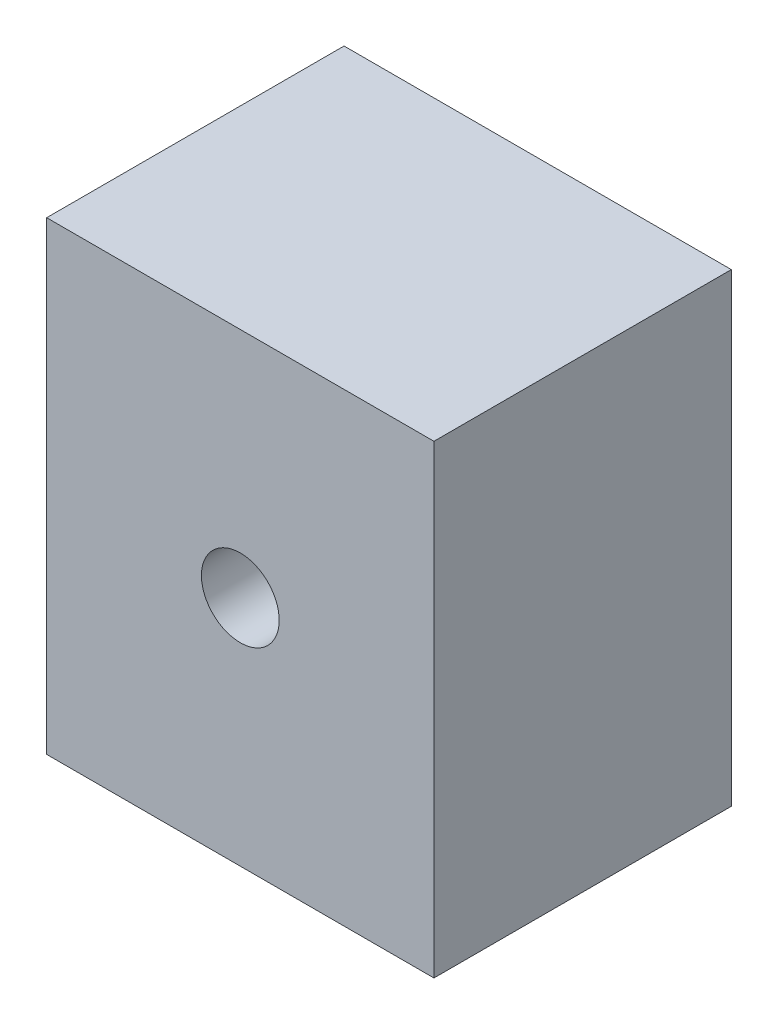
ISO-10303-21;
HEADER;
FILE_DESCRIPTION(('STEP AP214'),'2;1');
FILE_NAME('part.step','',(''),(''),'','','');
FILE_SCHEMA(('AUTOMOTIVE_DESIGN { 1 0 10303 214 1 1 1 1 }'));
ENDSEC;
DATA;
#1=APPLICATION_CONTEXT('core data for automotive mechanical design processes');
#2=APPLICATION_PROTOCOL_DEFINITION('international standard','automotive_design',2000,#1);
#3=PRODUCT_CONTEXT('',#1,'mechanical');
#4=PRODUCT('Part','Part','',(#3));
#5=PRODUCT_RELATED_PRODUCT_CATEGORY('part','',(#4));
#6=PRODUCT_DEFINITION_FORMATION('','',#4);
#7=PRODUCT_DEFINITION_CONTEXT('part definition',#1,'design');
#8=PRODUCT_DEFINITION('design','',#6,#7);
#9=PRODUCT_DEFINITION_SHAPE('','',#8);
#10=(LENGTH_UNIT() NAMED_UNIT(*) SI_UNIT(.MILLI.,.METRE.));
#11=(NAMED_UNIT(*) PLANE_ANGLE_UNIT() SI_UNIT($,.RADIAN.));
#12=(NAMED_UNIT(*) SI_UNIT($,.STERADIAN.) SOLID_ANGLE_UNIT());
#13=UNCERTAINTY_MEASURE_WITH_UNIT(LENGTH_MEASURE(1.E-05),#10,'distance_accuracy_value','');
#14=(GEOMETRIC_REPRESENTATION_CONTEXT(3) GLOBAL_UNCERTAINTY_ASSIGNED_CONTEXT((#13)) GLOBAL_UNIT_ASSIGNED_CONTEXT((#10,
#11,#12)) REPRESENTATION_CONTEXT('',''));
#15=CARTESIAN_POINT('',(0.,0.,0.));
#16=DIRECTION('',(0.,0.,1.));
#17=DIRECTION('',(1.,0.,0.));
#18=AXIS2_PLACEMENT_3D('',#15,#16,#17);
#19=CARTESIAN_POINT('',(-8.4644088498027,10.16,-10.));
#20=DIRECTION('',(1.,0.,0.));
#21=DIRECTION('',(0.,0.,-1.));
#22=AXIS2_PLACEMENT_3D('',#19,#20,#21);
#23=PLANE('',#22);
#24=DIRECTION('',(0.,0.,1.));
#25=VECTOR('',#24,1.);
#26=CARTESIAN_POINT('',(-8.4644088498027,-10.16,-10.));
#27=LINE('',#26,#25);
#28=CARTESIAN_POINT('',(-8.4644088498027,-10.16,-10.));
#29=VERTEX_POINT('',#28);
#30=CARTESIAN_POINT('',(-8.4644088498027,-10.16,3.));
#31=VERTEX_POINT('',#30);
#32=EDGE_CURVE('E195',#29,#31,#27,.T.);
#33=ORIENTED_EDGE('',*,*,#32,.T.);
#34=DIRECTION('',(0.,-1.,0.));
#35=VECTOR('',#34,1.);
#36=CARTESIAN_POINT('',(-8.4644088498027,10.16,3.));
#37=LINE('',#36,#35);
#38=CARTESIAN_POINT('',(-8.4644088498027,10.16,3.));
#39=VERTEX_POINT('',#38);
#40=EDGE_CURVE('E11',#39,#31,#37,.T.);
#41=ORIENTED_EDGE('',*,*,#40,.F.);
#42=DIRECTION('',(0.,0.,1.));
#43=VECTOR('',#42,1.);
#44=CARTESIAN_POINT('',(-8.4644088498027,10.16,-10.));
#45=LINE('',#44,#43);
#46=CARTESIAN_POINT('',(-8.4644088498027,10.16,-10.));
#47=VERTEX_POINT('',#46);
#48=EDGE_CURVE('E207',#47,#39,#45,.T.);
#49=ORIENTED_EDGE('',*,*,#48,.F.);
#50=DIRECTION('',(0.,-1.,0.));
#51=VECTOR('',#50,1.);
#52=CARTESIAN_POINT('',(-8.4644088498027,10.16,-10.));
#53=LINE('',#52,#51);
#54=EDGE_CURVE('E217',#47,#29,#53,.T.);
#55=ORIENTED_EDGE('',*,*,#54,.T.);
#56=EDGE_LOOP('',(#33,#41,#49,#55));
#57=FACE_BOUND('',#56,.T.);
#58=ADVANCED_FACE('F45',(#57),#23,.F.);
#59=CARTESIAN_POINT('',(-8.4644088498027,10.16,3.));
#60=DIRECTION('',(0.,0.,-1.));
#61=DIRECTION('',(-1.,0.,0.));
#62=AXIS2_PLACEMENT_3D('',#59,#60,#61);
#63=PLANE('',#62);
#64=CARTESIAN_POINT('',(0.,0.,3.));
#65=DIRECTION('',(0.,0.,-1.));
#66=DIRECTION('',(-1.,0.,0.));
#67=AXIS2_PLACEMENT_3D('',#64,#65,#66);
#68=CIRCLE('',#67,1.7);
#69=CARTESIAN_POINT('',(-1.7,0.,3.));
#70=VERTEX_POINT('',#69);
#71=EDGE_CURVE('E162',#70,#70,#68,.T.);
#72=ORIENTED_EDGE('',*,*,#71,.T.);
#73=EDGE_LOOP('',(#72));
#74=FACE_BOUND('',#73,.T.);
#75=DIRECTION('',(1.,0.,0.));
#76=VECTOR('',#75,1.);
#77=CARTESIAN_POINT('',(-8.4644088498027,-10.16,3.));
#78=LINE('',#77,#76);
#79=CARTESIAN_POINT('',(8.4644088498027,-10.16,3.));
#80=VERTEX_POINT('',#79);
#81=EDGE_CURVE('E221',#31,#80,#78,.T.);
#82=ORIENTED_EDGE('',*,*,#81,.T.);
#83=DIRECTION('',(0.,-1.,0.));
#84=VECTOR('',#83,1.);
#85=CARTESIAN_POINT('',(8.4644088498027,10.16,3.));
#86=LINE('',#85,#84);
#87=CARTESIAN_POINT('',(8.4644088498027,10.16,3.));
#88=VERTEX_POINT('',#87);
#89=EDGE_CURVE('E53',#88,#80,#86,.T.);
#90=ORIENTED_EDGE('',*,*,#89,.F.);
#91=DIRECTION('',(1.,0.,0.));
#92=VECTOR('',#91,1.);
#93=CARTESIAN_POINT('',(-8.4644088498027,10.16,3.));
#94=LINE('',#93,#92);
#95=EDGE_CURVE('E97',#39,#88,#94,.T.);
#96=ORIENTED_EDGE('',*,*,#95,.F.);
#97=ORIENTED_EDGE('',*,*,#40,.T.);
#98=EDGE_LOOP('',(#82,#90,#96,#97));
#99=FACE_BOUND('',#98,.T.);
#100=ADVANCED_FACE('F258',(#74,#99),#63,.F.);
#101=CARTESIAN_POINT('',(8.4644088498027,10.16,-10.));
#102=DIRECTION('',(-1.,0.,0.));
#103=DIRECTION('',(0.,0.,1.));
#104=AXIS2_PLACEMENT_3D('',#101,#102,#103);
#105=PLANE('',#104);
#106=DIRECTION('',(0.,0.,-1.));
#107=VECTOR('',#106,1.);
#108=CARTESIAN_POINT('',(8.4644088498027,-10.16,-10.));
#109=LINE('',#108,#107);
#110=CARTESIAN_POINT('',(8.4644088498027,-10.16,-10.));
#111=VERTEX_POINT('',#110);
#112=EDGE_CURVE('E224',#80,#111,#109,.T.);
#113=ORIENTED_EDGE('',*,*,#112,.T.);
#114=DIRECTION('',(0.,-1.,0.));
#115=VECTOR('',#114,1.);
#116=CARTESIAN_POINT('',(8.4644088498027,10.16,-10.));
#117=LINE('',#116,#115);
#118=CARTESIAN_POINT('',(8.4644088498027,10.16,-10.));
#119=VERTEX_POINT('',#118);
#120=EDGE_CURVE('E231',#119,#111,#117,.T.);
#121=ORIENTED_EDGE('',*,*,#120,.F.);
#122=DIRECTION('',(0.,0.,-1.));
#123=VECTOR('',#122,1.);
#124=CARTESIAN_POINT('',(8.4644088498027,10.16,-10.));
#125=LINE('',#124,#123);
#126=EDGE_CURVE('E212',#88,#119,#125,.T.);
#127=ORIENTED_EDGE('',*,*,#126,.F.);
#128=ORIENTED_EDGE('',*,*,#89,.T.);
#129=EDGE_LOOP('',(#113,#121,#127,#128));
#130=FACE_BOUND('',#129,.T.);
#131=ADVANCED_FACE('F238',(#130),#105,.F.);
#132=CARTESIAN_POINT('',(-8.4644088498027,10.16,-10.));
#133=DIRECTION('',(0.,0.,1.));
#134=DIRECTION('',(1.,0.,0.));
#135=AXIS2_PLACEMENT_3D('',#132,#133,#134);
#136=PLANE('',#135);
#137=DIRECTION('',(-0.499999999999995,0.866025403784442,0.));
#138=VECTOR('',#137,1.);
#139=CARTESIAN_POINT('',(-2.10011160417727,-1.21249999999999,-10.));
#140=LINE('',#139,#138);
#141=CARTESIAN_POINT('',(-1.40007440278487,-2.42499999999998,-10.));
#142=VERTEX_POINT('',#141);
#143=CARTESIAN_POINT('',(-2.80014880556968,0.,-10.));
#144=VERTEX_POINT('',#143);
#145=EDGE_CURVE('E178',#142,#144,#140,.T.);
#146=ORIENTED_EDGE('',*,*,#145,.F.);
#147=DIRECTION('',(-1.,0.,0.));
#148=VECTOR('',#147,1.);
#149=CARTESIAN_POINT('',(0.,-2.42499999999999,-10.));
#150=LINE('',#149,#148);
#151=CARTESIAN_POINT('',(1.40007440278481,-2.425,-10.));
#152=VERTEX_POINT('',#151);
#153=EDGE_CURVE('E60',#152,#142,#150,.T.);
#154=ORIENTED_EDGE('',*,*,#153,.F.);
#155=DIRECTION('',(-0.500000000000007,-0.866025403784435,0.));
#156=VECTOR('',#155,1.);
#157=CARTESIAN_POINT('',(2.10011160417724,-1.21250000000001,-10.));
#158=LINE('',#157,#156);
#159=CARTESIAN_POINT('',(2.80014880556968,0.,-10.));
#160=VERTEX_POINT('',#159);
#161=EDGE_CURVE('E155',#160,#152,#158,.T.);
#162=ORIENTED_EDGE('',*,*,#161,.F.);
#163=DIRECTION('',(0.499999999999995,-0.866025403784442,0.));
#164=VECTOR('',#163,1.);
#165=CARTESIAN_POINT('',(2.10011160417726,1.21249999999998,-10.));
#166=LINE('',#165,#164);
#167=CARTESIAN_POINT('',(1.40007440278485,2.42499999999998,-10.));
#168=VERTEX_POINT('',#167);
#169=EDGE_CURVE('E159',#168,#160,#166,.T.);
#170=ORIENTED_EDGE('',*,*,#169,.F.);
#171=DIRECTION('',(1.,0.,0.));
#172=VECTOR('',#171,1.);
#173=CARTESIAN_POINT('',(0.,2.42499999999999,-10.));
#174=LINE('',#173,#172);
#175=CARTESIAN_POINT('',(-1.40007440278483,2.42499999999999,-10.));
#176=VERTEX_POINT('',#175);
#177=EDGE_CURVE('E185',#176,#168,#174,.T.);
#178=ORIENTED_EDGE('',*,*,#177,.F.);
#179=DIRECTION('',(0.500000000000001,0.866025403784438,0.));
#180=VECTOR('',#179,1.);
#181=CARTESIAN_POINT('',(-2.10011160417725,1.2125,-10.));
#182=LINE('',#181,#180);
#183=EDGE_CURVE('E181',#144,#176,#182,.T.);
#184=ORIENTED_EDGE('',*,*,#183,.F.);
#185=EDGE_LOOP('',(#146,#154,#162,#170,#178,#184));
#186=FACE_BOUND('',#185,.T.);
#187=DIRECTION('',(-1.,0.,0.));
#188=VECTOR('',#187,1.);
#189=CARTESIAN_POINT('',(-8.4644088498027,-10.16,-10.));
#190=LINE('',#189,#188);
#191=EDGE_CURVE('E90',#111,#29,#190,.T.);
#192=ORIENTED_EDGE('',*,*,#191,.T.);
#193=ORIENTED_EDGE('',*,*,#54,.F.);
#194=DIRECTION('',(-1.,0.,0.));
#195=VECTOR('',#194,1.);
#196=CARTESIAN_POINT('',(-8.4644088498027,10.16,-10.));
#197=LINE('',#196,#195);
#198=EDGE_CURVE('E69',#119,#47,#197,.T.);
#199=ORIENTED_EDGE('',*,*,#198,.F.);
#200=ORIENTED_EDGE('',*,*,#120,.T.);
#201=EDGE_LOOP('',(#192,#193,#199,#200));
#202=FACE_BOUND('',#201,.T.);
#203=ADVANCED_FACE('F246',(#186,#202),#136,.F.);
#204=CARTESIAN_POINT('',(0.,10.16,0.));
#205=DIRECTION('',(0.,1.,0.));
#206=DIRECTION('',(0.,0.,1.));
#207=AXIS2_PLACEMENT_3D('',#204,#205,#206);
#208=PLANE('',#207);
#209=ORIENTED_EDGE('',*,*,#48,.T.);
#210=ORIENTED_EDGE('',*,*,#95,.T.);
#211=ORIENTED_EDGE('',*,*,#126,.T.);
#212=ORIENTED_EDGE('',*,*,#198,.T.);
#213=EDGE_LOOP('',(#209,#210,#211,#212));
#214=FACE_BOUND('',#213,.T.);
#215=ADVANCED_FACE('F248',(#214),#208,.T.);
#216=CARTESIAN_POINT('',(0.,-10.16,0.));
#217=DIRECTION('',(0.,1.,0.));
#218=DIRECTION('',(0.,0.,1.));
#219=AXIS2_PLACEMENT_3D('',#216,#217,#218);
#220=PLANE('',#219);
#221=ORIENTED_EDGE('',*,*,#32,.F.);
#222=ORIENTED_EDGE('',*,*,#191,.F.);
#223=ORIENTED_EDGE('',*,*,#112,.F.);
#224=ORIENTED_EDGE('',*,*,#81,.F.);
#225=EDGE_LOOP('',(#221,#222,#223,#224));
#226=FACE_BOUND('',#225,.T.);
#227=ADVANCED_FACE('F242',(#226),#220,.F.);
#228=CARTESIAN_POINT('',(0.,-2.42499999999999,-0.0940000000000229));
#229=DIRECTION('',(0.,-1.,0.));
#230=DIRECTION('',(1.,0.,0.));
#231=AXIS2_PLACEMENT_3D('',#228,#229,#230);
#232=PLANE('',#231);
#233=ORIENTED_EDGE('',*,*,#153,.T.);
#234=DIRECTION('',(0.,0.,-1.));
#235=VECTOR('',#234,1.);
#236=CARTESIAN_POINT('',(-1.40007440278487,-2.42499999999997,-0.0940000000000229));
#237=LINE('',#236,#235);
#238=CARTESIAN_POINT('',(-1.40007440278487,-2.42499999999997,-0.0940000000000229));
#239=VERTEX_POINT('',#238);
#240=EDGE_CURVE('E129',#239,#142,#237,.T.);
#241=ORIENTED_EDGE('',*,*,#240,.F.);
#242=DIRECTION('',(-1.,0.,0.));
#243=VECTOR('',#242,1.);
#244=CARTESIAN_POINT('',(0.,-2.42499999999999,-0.0940000000000229));
#245=LINE('',#244,#243);
#246=CARTESIAN_POINT('',(1.40007440278481,-2.425,-0.0940000000000229));
#247=VERTEX_POINT('',#246);
#248=EDGE_CURVE('E133',#247,#239,#245,.T.);
#249=ORIENTED_EDGE('',*,*,#248,.F.);
#250=DIRECTION('',(0.,0.,-1.));
#251=VECTOR('',#250,1.);
#252=CARTESIAN_POINT('',(1.40007440278481,-2.425,-0.0940000000000229));
#253=LINE('',#252,#251);
#254=EDGE_CURVE('E192',#247,#152,#253,.T.);
#255=ORIENTED_EDGE('',*,*,#254,.T.);
#256=EDGE_LOOP('',(#233,#241,#249,#255));
#257=FACE_BOUND('',#256,.T.);
#258=ADVANCED_FACE('F131',(#257),#232,.F.);
#259=CARTESIAN_POINT('',(2.10011160417724,-1.21250000000001,-0.0940000000000229));
#260=DIRECTION('',(0.866025403784435,-0.500000000000007,0.));
#261=DIRECTION('',(0.500000000000007,0.866025403784435,0.));
#262=AXIS2_PLACEMENT_3D('',#259,#260,#261);
#263=PLANE('',#262);
#264=ORIENTED_EDGE('',*,*,#161,.T.);
#265=ORIENTED_EDGE('',*,*,#254,.F.);
#266=DIRECTION('',(-0.500000000000007,-0.866025403784435,0.));
#267=VECTOR('',#266,1.);
#268=CARTESIAN_POINT('',(2.10011160417724,-1.21250000000001,-0.0940000000000229));
#269=LINE('',#268,#267);
#270=CARTESIAN_POINT('',(2.80014880556968,0.,-0.0940000000000229));
#271=VERTEX_POINT('',#270);
#272=EDGE_CURVE('E140',#271,#247,#269,.T.);
#273=ORIENTED_EDGE('',*,*,#272,.F.);
#274=DIRECTION('',(0.,0.,-1.));
#275=VECTOR('',#274,1.);
#276=CARTESIAN_POINT('',(2.80014880556968,0.,-0.0940000000000229));
#277=LINE('',#276,#275);
#278=EDGE_CURVE('E196',#271,#160,#277,.T.);
#279=ORIENTED_EDGE('',*,*,#278,.T.);
#280=EDGE_LOOP('',(#264,#265,#273,#279));
#281=FACE_BOUND('',#280,.T.);
#282=ADVANCED_FACE('F289',(#281),#263,.F.);
#283=CARTESIAN_POINT('',(2.10011160417726,1.21249999999998,-0.0940000000000229));
#284=DIRECTION('',(0.866025403784442,0.499999999999995,0.));
#285=DIRECTION('',(-0.499999999999995,0.866025403784442,0.));
#286=AXIS2_PLACEMENT_3D('',#283,#284,#285);
#287=PLANE('',#286);
#288=ORIENTED_EDGE('',*,*,#169,.T.);
#289=ORIENTED_EDGE('',*,*,#278,.F.);
#290=DIRECTION('',(0.499999999999995,-0.866025403784442,0.));
#291=VECTOR('',#290,1.);
#292=CARTESIAN_POINT('',(2.10011160417726,1.21249999999998,-0.0940000000000229));
#293=LINE('',#292,#291);
#294=CARTESIAN_POINT('',(1.40007440278485,2.42499999999998,-0.0940000000000229));
#295=VERTEX_POINT('',#294);
#296=EDGE_CURVE('E171',#295,#271,#293,.T.);
#297=ORIENTED_EDGE('',*,*,#296,.F.);
#298=DIRECTION('',(0.,0.,-1.));
#299=VECTOR('',#298,1.);
#300=CARTESIAN_POINT('',(1.40007440278485,2.42499999999998,-0.0940000000000229));
#301=LINE('',#300,#299);
#302=EDGE_CURVE('E199',#295,#168,#301,.T.);
#303=ORIENTED_EDGE('',*,*,#302,.T.);
#304=EDGE_LOOP('',(#288,#289,#297,#303));
#305=FACE_BOUND('',#304,.T.);
#306=ADVANCED_FACE('F292',(#305),#287,.F.);
#307=CARTESIAN_POINT('',(0.,2.42499999999999,-0.0940000000000229));
#308=DIRECTION('',(0.,1.,0.));
#309=DIRECTION('',(-1.,0.,0.));
#310=AXIS2_PLACEMENT_3D('',#307,#308,#309);
#311=PLANE('',#310);
#312=ORIENTED_EDGE('',*,*,#177,.T.);
#313=ORIENTED_EDGE('',*,*,#302,.F.);
#314=DIRECTION('',(1.,0.,0.));
#315=VECTOR('',#314,1.);
#316=CARTESIAN_POINT('',(0.,2.42499999999999,-0.0940000000000229));
#317=LINE('',#316,#315);
#318=CARTESIAN_POINT('',(-1.40007440278483,2.42499999999999,-0.0940000000000229));
#319=VERTEX_POINT('',#318);
#320=EDGE_CURVE('E167',#319,#295,#317,.T.);
#321=ORIENTED_EDGE('',*,*,#320,.F.);
#322=DIRECTION('',(0.,0.,-1.));
#323=VECTOR('',#322,1.);
#324=CARTESIAN_POINT('',(-1.40007440278483,2.42499999999999,-0.0940000000000229));
#325=LINE('',#324,#323);
#326=EDGE_CURVE('E202',#319,#176,#325,.T.);
#327=ORIENTED_EDGE('',*,*,#326,.T.);
#328=EDGE_LOOP('',(#312,#313,#321,#327));
#329=FACE_BOUND('',#328,.T.);
#330=ADVANCED_FACE('F296',(#329),#311,.F.);
#331=CARTESIAN_POINT('',(-2.10011160417725,1.2125,-0.0940000000000229));
#332=DIRECTION('',(-0.866025403784438,0.500000000000001,0.));
#333=DIRECTION('',(-0.500000000000001,-0.866025403784438,0.));
#334=AXIS2_PLACEMENT_3D('',#331,#332,#333);
#335=PLANE('',#334);
#336=ORIENTED_EDGE('',*,*,#183,.T.);
#337=ORIENTED_EDGE('',*,*,#326,.F.);
#338=DIRECTION('',(0.500000000000001,0.866025403784438,0.));
#339=VECTOR('',#338,1.);
#340=CARTESIAN_POINT('',(-2.10011160417725,1.2125,-0.0940000000000229));
#341=LINE('',#340,#339);
#342=CARTESIAN_POINT('',(-2.80014880556968,0.,-0.0940000000000229));
#343=VERTEX_POINT('',#342);
#344=EDGE_CURVE('E149',#343,#319,#341,.T.);
#345=ORIENTED_EDGE('',*,*,#344,.F.);
#346=DIRECTION('',(0.,0.,-1.));
#347=VECTOR('',#346,1.);
#348=CARTESIAN_POINT('',(-2.80014880556968,0.,-0.0940000000000229));
#349=LINE('',#348,#347);
#350=EDGE_CURVE('E139',#343,#144,#349,.T.);
#351=ORIENTED_EDGE('',*,*,#350,.T.);
#352=EDGE_LOOP('',(#336,#337,#345,#351));
#353=FACE_BOUND('',#352,.T.);
#354=ADVANCED_FACE('F286',(#353),#335,.F.);
#355=CARTESIAN_POINT('',(-2.10011160417727,-1.21249999999999,-0.0940000000000229));
#356=DIRECTION('',(-0.866025403784441,-0.499999999999995,0.));
#357=DIRECTION('',(0.499999999999995,-0.866025403784441,0.));
#358=AXIS2_PLACEMENT_3D('',#355,#356,#357);
#359=PLANE('',#358);
#360=ORIENTED_EDGE('',*,*,#145,.T.);
#361=ORIENTED_EDGE('',*,*,#350,.F.);
#362=DIRECTION('',(-0.499999999999995,0.866025403784442,0.));
#363=VECTOR('',#362,1.);
#364=CARTESIAN_POINT('',(-2.10011160417727,-1.21249999999999,-0.0940000000000229));
#365=LINE('',#364,#363);
#366=EDGE_CURVE('E143',#239,#343,#365,.T.);
#367=ORIENTED_EDGE('',*,*,#366,.F.);
#368=ORIENTED_EDGE('',*,*,#240,.T.);
#369=EDGE_LOOP('',(#360,#361,#367,#368));
#370=FACE_BOUND('',#369,.T.);
#371=ADVANCED_FACE('F144',(#370),#359,.F.);
#372=CARTESIAN_POINT('',(0.,0.,-0.0940000000000229));
#373=DIRECTION('',(0.,0.,-1.));
#374=DIRECTION('',(-1.,0.,0.));
#375=AXIS2_PLACEMENT_3D('',#372,#373,#374);
#376=PLANE('',#375);
#377=CARTESIAN_POINT('',(0.,0.,-0.0940000000000229));
#378=DIRECTION('',(0.,0.,-1.));
#379=DIRECTION('',(-1.,0.,0.));
#380=AXIS2_PLACEMENT_3D('',#377,#378,#379);
#381=CIRCLE('',#380,1.7);
#382=CARTESIAN_POINT('',(-1.7,0.,-0.0940000000000229));
#383=VERTEX_POINT('',#382);
#384=EDGE_CURVE('E274',#383,#383,#381,.T.);
#385=ORIENTED_EDGE('',*,*,#384,.F.);
#386=EDGE_LOOP('',(#385));
#387=FACE_BOUND('',#386,.T.);
#388=ORIENTED_EDGE('',*,*,#248,.T.);
#389=ORIENTED_EDGE('',*,*,#366,.T.);
#390=ORIENTED_EDGE('',*,*,#344,.T.);
#391=ORIENTED_EDGE('',*,*,#320,.T.);
#392=ORIENTED_EDGE('',*,*,#296,.T.);
#393=ORIENTED_EDGE('',*,*,#272,.T.);
#394=EDGE_LOOP('',(#388,#389,#390,#391,#392,#393));
#395=FACE_BOUND('',#394,.T.);
#396=ADVANCED_FACE('F151',(#387,#395),#376,.T.);
#397=CARTESIAN_POINT('',(0.,0.,5.74799999999998));
#398=DIRECTION('',(0.,0.,-1.));
#399=DIRECTION('',(-1.,0.,0.));
#400=AXIS2_PLACEMENT_3D('',#397,#398,#399);
#401=CYLINDRICAL_SURFACE('',#400,1.7);
#402=ORIENTED_EDGE('',*,*,#384,.T.);
#403=EDGE_LOOP('',(#402));
#404=FACE_BOUND('',#403,.T.);
#405=ORIENTED_EDGE('',*,*,#71,.F.);
#406=EDGE_LOOP('',(#405));
#407=FACE_BOUND('',#406,.T.);
#408=ADVANCED_FACE('F279',(#404,#407),#401,.F.);
#409=CLOSED_SHELL('',(#58,#100,#131,#203,#215,#227,#258,#282,#306,#330,#354,#371,#396,#408));
#410=MANIFOLD_SOLID_BREP('B2',#409);
#411=ADVANCED_BREP_SHAPE_REPRESENTATION('',(#18,#410),#14);
#412=SHAPE_DEFINITION_REPRESENTATION(#9,#411);
ENDSEC;
END-ISO-10303-21;
